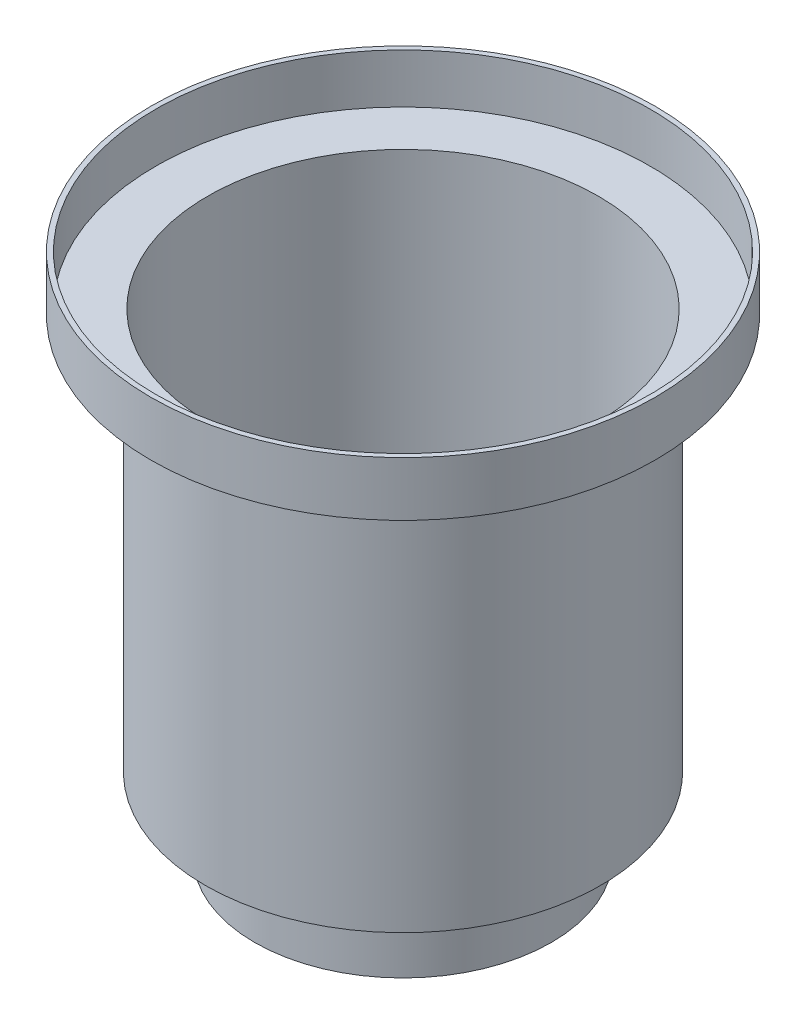
ISO-10303-21;
HEADER;
FILE_DESCRIPTION(('STEP AP214'),'2;1');
FILE_NAME('part.step','',(''),(''),'','','');
FILE_SCHEMA(('AUTOMOTIVE_DESIGN { 1 0 10303 214 1 1 1 1 }'));
ENDSEC;
DATA;
#1=APPLICATION_CONTEXT('core data for automotive mechanical design processes');
#2=APPLICATION_PROTOCOL_DEFINITION('international standard','automotive_design',2000,#1);
#3=PRODUCT_CONTEXT('',#1,'mechanical');
#4=PRODUCT('Part','Part','',(#3));
#5=PRODUCT_RELATED_PRODUCT_CATEGORY('part','',(#4));
#6=PRODUCT_DEFINITION_FORMATION('','',#4);
#7=PRODUCT_DEFINITION_CONTEXT('part definition',#1,'design');
#8=PRODUCT_DEFINITION('design','',#6,#7);
#9=PRODUCT_DEFINITION_SHAPE('','',#8);
#10=(LENGTH_UNIT() NAMED_UNIT(*) SI_UNIT(.MILLI.,.METRE.));
#11=(NAMED_UNIT(*) PLANE_ANGLE_UNIT() SI_UNIT($,.RADIAN.));
#12=(NAMED_UNIT(*) SI_UNIT($,.STERADIAN.) SOLID_ANGLE_UNIT());
#13=UNCERTAINTY_MEASURE_WITH_UNIT(LENGTH_MEASURE(1.E-05),#10,'distance_accuracy_value','');
#14=(GEOMETRIC_REPRESENTATION_CONTEXT(3) GLOBAL_UNCERTAINTY_ASSIGNED_CONTEXT((#13)) GLOBAL_UNIT_ASSIGNED_CONTEXT((#10,
#11,#12)) REPRESENTATION_CONTEXT('',''));
#15=CARTESIAN_POINT('',(0.,0.,0.));
#16=DIRECTION('',(0.,0.,1.));
#17=DIRECTION('',(1.,0.,0.));
#18=AXIS2_PLACEMENT_3D('',#15,#16,#17);
#19=CARTESIAN_POINT('',(0.,-8.6,0.));
#20=DIRECTION('',(0.,-1.,0.));
#21=DIRECTION('',(0.,0.,-1.));
#22=AXIS2_PLACEMENT_3D('',#19,#20,#21);
#23=PLANE('',#22);
#24=CARTESIAN_POINT('',(0.,-8.6,0.));
#25=DIRECTION('',(0.,-1.,0.));
#26=DIRECTION('',(0.,0.,-1.));
#27=AXIS2_PLACEMENT_3D('',#24,#25,#26);
#28=CIRCLE('',#27,2.77639320225002);
#29=CARTESIAN_POINT('',(0.,-8.6,-2.77639320225002));
#30=VERTEX_POINT('',#29);
#31=EDGE_CURVE('E141',#30,#30,#28,.T.);
#32=ORIENTED_EDGE('',*,*,#31,.F.);
#33=EDGE_LOOP('',(#32));
#34=FACE_BOUND('',#33,.T.);
#35=CARTESIAN_POINT('',(0.,-8.6,0.));
#36=DIRECTION('',(0.,-1.,0.));
#37=DIRECTION('',(0.,0.,-1.));
#38=AXIS2_PLACEMENT_3D('',#35,#36,#37);
#39=CIRCLE('',#38,2.9);
#40=CARTESIAN_POINT('',(0.,-8.6,-2.9));
#41=VERTEX_POINT('',#40);
#42=EDGE_CURVE('E12',#41,#41,#39,.F.);
#43=ORIENTED_EDGE('',*,*,#42,.F.);
#44=EDGE_LOOP('',(#43));
#45=FACE_BOUND('',#44,.T.);
#46=ADVANCED_FACE('F44',(#34,#45),#23,.T.);
#47=CARTESIAN_POINT('',(0.,1.,0.));
#48=DIRECTION('',(0.,1.,0.));
#49=DIRECTION('',(0.,0.,1.));
#50=AXIS2_PLACEMENT_3D('',#47,#48,#49);
#51=PLANE('',#50);
#52=CARTESIAN_POINT('',(0.,1.,0.));
#53=DIRECTION('',(0.,1.,0.));
#54=DIRECTION('',(0.,0.,1.));
#55=AXIS2_PLACEMENT_3D('',#52,#53,#54);
#56=CIRCLE('',#55,5.);
#57=CARTESIAN_POINT('',(0.,1.,5.));
#58=VERTEX_POINT('',#57);
#59=EDGE_CURVE('E103',#58,#58,#56,.T.);
#60=ORIENTED_EDGE('',*,*,#59,.F.);
#61=EDGE_LOOP('',(#60));
#62=FACE_BOUND('',#61,.T.);
#63=CARTESIAN_POINT('',(0.,1.,0.));
#64=DIRECTION('',(0.,1.,0.));
#65=DIRECTION('',(0.,0.,1.));
#66=AXIS2_PLACEMENT_3D('',#63,#64,#65);
#67=CIRCLE('',#66,5.1);
#68=CARTESIAN_POINT('',(0.,1.,5.1));
#69=VERTEX_POINT('',#68);
#70=EDGE_CURVE('E53',#69,#69,#67,.T.);
#71=ORIENTED_EDGE('',*,*,#70,.T.);
#72=EDGE_LOOP('',(#71));
#73=FACE_BOUND('',#72,.T.);
#74=ADVANCED_FACE('F72',(#62,#73),#51,.T.);
#75=CARTESIAN_POINT('',(0.,0.,0.));
#76=DIRECTION('',(0.,1.,0.));
#77=DIRECTION('',(0.,0.,1.));
#78=AXIS2_PLACEMENT_3D('',#75,#76,#77);
#79=CYLINDRICAL_SURFACE('',#78,5.1);
#80=ORIENTED_EDGE('',*,*,#70,.F.);
#81=EDGE_LOOP('',(#80));
#82=FACE_BOUND('',#81,.T.);
#83=CARTESIAN_POINT('',(0.,-0.1,0.));
#84=DIRECTION('',(0.,-1.,0.));
#85=DIRECTION('',(0.,0.,-1.));
#86=AXIS2_PLACEMENT_3D('',#83,#84,#85);
#87=CIRCLE('',#86,5.1);
#88=CARTESIAN_POINT('',(0.,-0.1,-5.1));
#89=VERTEX_POINT('',#88);
#90=EDGE_CURVE('E97',#89,#89,#87,.T.);
#91=ORIENTED_EDGE('',*,*,#90,.F.);
#92=EDGE_LOOP('',(#91));
#93=FACE_BOUND('',#92,.T.);
#94=ADVANCED_FACE('F46',(#82,#93),#79,.T.);
#95=CARTESIAN_POINT('',(0.,0.,0.));
#96=DIRECTION('',(0.,1.,0.));
#97=DIRECTION('',(0.,0.,1.));
#98=AXIS2_PLACEMENT_3D('',#95,#96,#97);
#99=CYLINDRICAL_SURFACE('',#98,5.);
#100=ORIENTED_EDGE('',*,*,#59,.T.);
#101=EDGE_LOOP('',(#100));
#102=FACE_BOUND('',#101,.T.);
#103=CARTESIAN_POINT('',(0.,0.,0.));
#104=DIRECTION('',(0.,1.,0.));
#105=DIRECTION('',(0.,0.,1.));
#106=AXIS2_PLACEMENT_3D('',#103,#104,#105);
#107=CIRCLE('',#106,5.);
#108=CARTESIAN_POINT('',(0.,0.,5.));
#109=VERTEX_POINT('',#108);
#110=EDGE_CURVE('E99',#109,#109,#107,.T.);
#111=ORIENTED_EDGE('',*,*,#110,.F.);
#112=EDGE_LOOP('',(#111));
#113=FACE_BOUND('',#112,.T.);
#114=ADVANCED_FACE('F79',(#102,#113),#99,.F.);
#115=CARTESIAN_POINT('',(0.,0.,0.));
#116=DIRECTION('',(0.,-1.,0.));
#117=DIRECTION('',(0.,0.,-1.));
#118=AXIS2_PLACEMENT_3D('',#115,#116,#117);
#119=PLANE('',#118);
#120=CARTESIAN_POINT('',(0.,0.,0.));
#121=DIRECTION('',(0.,1.,0.));
#122=DIRECTION('',(0.,0.,1.));
#123=AXIS2_PLACEMENT_3D('',#120,#121,#122);
#124=CIRCLE('',#123,3.95);
#125=CARTESIAN_POINT('',(0.,0.,3.95));
#126=VERTEX_POINT('',#125);
#127=EDGE_CURVE('E185',#126,#126,#124,.T.);
#128=ORIENTED_EDGE('',*,*,#127,.F.);
#129=EDGE_LOOP('',(#128));
#130=FACE_BOUND('',#129,.T.);
#131=ORIENTED_EDGE('',*,*,#110,.T.);
#132=EDGE_LOOP('',(#131));
#133=FACE_BOUND('',#132,.T.);
#134=ADVANCED_FACE('F89',(#130,#133),#119,.F.);
#135=CARTESIAN_POINT('',(0.,-0.1,0.));
#136=DIRECTION('',(0.,-1.,0.));
#137=DIRECTION('',(0.,0.,-1.));
#138=AXIS2_PLACEMENT_3D('',#135,#136,#137);
#139=PLANE('',#138);
#140=CARTESIAN_POINT('',(0.,-0.1,0.));
#141=DIRECTION('',(0.,-1.,0.));
#142=DIRECTION('',(0.,0.,-1.));
#143=AXIS2_PLACEMENT_3D('',#140,#141,#142);
#144=CIRCLE('',#143,4.);
#145=CARTESIAN_POINT('',(0.,-0.1,-4.));
#146=VERTEX_POINT('',#145);
#147=EDGE_CURVE('E106',#146,#146,#144,.T.);
#148=ORIENTED_EDGE('',*,*,#147,.F.);
#149=EDGE_LOOP('',(#148));
#150=FACE_BOUND('',#149,.T.);
#151=ORIENTED_EDGE('',*,*,#90,.T.);
#152=EDGE_LOOP('',(#151));
#153=FACE_BOUND('',#152,.T.);
#154=ADVANCED_FACE('F173',(#150,#153),#139,.T.);
#155=CARTESIAN_POINT('',(0.,-8.1,0.));
#156=DIRECTION('',(0.,1.,0.));
#157=DIRECTION('',(0.,0.,1.));
#158=AXIS2_PLACEMENT_3D('',#155,#156,#157);
#159=CYLINDRICAL_SURFACE('',#158,4.);
#160=CARTESIAN_POINT('',(0.,-8.1,0.));
#161=DIRECTION('',(0.,-1.,0.));
#162=DIRECTION('',(0.,0.,-1.));
#163=AXIS2_PLACEMENT_3D('',#160,#161,#162);
#164=CIRCLE('',#163,4.);
#165=CARTESIAN_POINT('',(0.,-8.1,-4.));
#166=VERTEX_POINT('',#165);
#167=EDGE_CURVE('E100',#166,#166,#164,.T.);
#168=ORIENTED_EDGE('',*,*,#167,.F.);
#169=EDGE_LOOP('',(#168));
#170=FACE_BOUND('',#169,.T.);
#171=ORIENTED_EDGE('',*,*,#147,.T.);
#172=EDGE_LOOP('',(#171));
#173=FACE_BOUND('',#172,.T.);
#174=ADVANCED_FACE('F169',(#170,#173),#159,.T.);
#175=CARTESIAN_POINT('',(0.,-8.1,0.));
#176=DIRECTION('',(0.,1.,0.));
#177=DIRECTION('',(0.,0.,1.));
#178=AXIS2_PLACEMENT_3D('',#175,#176,#177);
#179=CYLINDRICAL_SURFACE('',#178,3.95);
#180=CARTESIAN_POINT('',(0.,-8.1,0.));
#181=DIRECTION('',(0.,1.,0.));
#182=DIRECTION('',(0.,0.,1.));
#183=AXIS2_PLACEMENT_3D('',#180,#181,#182);
#184=CIRCLE('',#183,3.95);
#185=CARTESIAN_POINT('',(0.,-8.1,3.95));
#186=VERTEX_POINT('',#185);
#187=EDGE_CURVE('E189',#186,#186,#184,.T.);
#188=ORIENTED_EDGE('',*,*,#187,.F.);
#189=EDGE_LOOP('',(#188));
#190=FACE_BOUND('',#189,.T.);
#191=ORIENTED_EDGE('',*,*,#127,.T.);
#192=EDGE_LOOP('',(#191));
#193=FACE_BOUND('',#192,.T.);
#194=ADVANCED_FACE('F166',(#190,#193),#179,.F.);
#195=CARTESIAN_POINT('',(4.,-8.1,0.));
#196=DIRECTION('',(0.,1.,0.));
#197=DIRECTION('',(0.,0.,1.));
#198=AXIS2_PLACEMENT_3D('',#195,#196,#197);
#199=PLANE('',#198);
#200=CARTESIAN_POINT('',(0.,-8.1,0.));
#201=DIRECTION('',(0.,1.,0.));
#202=DIRECTION('',(0.,0.,1.));
#203=AXIS2_PLACEMENT_3D('',#200,#201,#202);
#204=CIRCLE('',#203,3.77639320225002);
#205=CARTESIAN_POINT('',(0.,-8.1,3.77639320225002));
#206=VERTEX_POINT('',#205);
#207=EDGE_CURVE('E144',#206,#206,#204,.F.);
#208=ORIENTED_EDGE('',*,*,#207,.T.);
#209=EDGE_LOOP('',(#208));
#210=FACE_BOUND('',#209,.T.);
#211=ORIENTED_EDGE('',*,*,#187,.T.);
#212=EDGE_LOOP('',(#211));
#213=FACE_BOUND('',#212,.T.);
#214=ADVANCED_FACE('F137',(#210,#213),#199,.T.);
#215=CARTESIAN_POINT('',(0.,-8.6,0.));
#216=DIRECTION('',(0.,1.,0.));
#217=DIRECTION('',(0.,0.,1.));
#218=AXIS2_PLACEMENT_3D('',#215,#216,#217);
#219=CONICAL_SURFACE('',#218,3.,1.10714871779409);
#220=CARTESIAN_POINT('',(0.,-8.6,0.));
#221=DIRECTION('',(0.,-1.,0.));
#222=DIRECTION('',(0.,0.,-1.));
#223=AXIS2_PLACEMENT_3D('',#220,#221,#222);
#224=CIRCLE('',#223,3.);
#225=CARTESIAN_POINT('',(0.,-8.6,-3.));
#226=VERTEX_POINT('',#225);
#227=EDGE_CURVE('E48',#226,#226,#224,.T.);
#228=ORIENTED_EDGE('',*,*,#227,.F.);
#229=EDGE_LOOP('',(#228));
#230=FACE_BOUND('',#229,.T.);
#231=ORIENTED_EDGE('',*,*,#167,.T.);
#232=EDGE_LOOP('',(#231));
#233=FACE_BOUND('',#232,.T.);
#234=ADVANCED_FACE('F132',(#230,#233),#219,.T.);
#235=CARTESIAN_POINT('',(0.,-8.51055728090001,0.));
#236=DIRECTION('',(0.,1.,0.));
#237=DIRECTION('',(0.,0.,1.));
#238=AXIS2_PLACEMENT_3D('',#235,#236,#237);
#239=CONICAL_SURFACE('',#238,2.95527864045,1.10714871779409);
#240=ORIENTED_EDGE('',*,*,#31,.T.);
#241=EDGE_LOOP('',(#240));
#242=FACE_BOUND('',#241,.T.);
#243=ORIENTED_EDGE('',*,*,#207,.F.);
#244=EDGE_LOOP('',(#243));
#245=FACE_BOUND('',#244,.T.);
#246=ADVANCED_FACE('F129',(#242,#245),#239,.F.);
#247=CARTESIAN_POINT('',(0.,-9.6,0.));
#248=DIRECTION('',(0.,1.,0.));
#249=DIRECTION('',(0.,0.,1.));
#250=AXIS2_PLACEMENT_3D('',#247,#248,#249);
#251=CYLINDRICAL_SURFACE('',#250,3.);
#252=CARTESIAN_POINT('',(0.,-9.6,0.));
#253=DIRECTION('',(0.,-1.,0.));
#254=DIRECTION('',(0.,0.,-1.));
#255=AXIS2_PLACEMENT_3D('',#252,#253,#254);
#256=CIRCLE('',#255,3.);
#257=CARTESIAN_POINT('',(0.,-9.6,-3.));
#258=VERTEX_POINT('',#257);
#259=EDGE_CURVE('E146',#258,#258,#256,.T.);
#260=ORIENTED_EDGE('',*,*,#259,.F.);
#261=EDGE_LOOP('',(#260));
#262=FACE_BOUND('',#261,.T.);
#263=ORIENTED_EDGE('',*,*,#227,.T.);
#264=EDGE_LOOP('',(#263));
#265=FACE_BOUND('',#264,.T.);
#266=ADVANCED_FACE('F120',(#262,#265),#251,.T.);
#267=CARTESIAN_POINT('',(0.,-9.6,0.));
#268=DIRECTION('',(0.,1.,0.));
#269=DIRECTION('',(0.,0.,1.));
#270=AXIS2_PLACEMENT_3D('',#267,#268,#269);
#271=CYLINDRICAL_SURFACE('',#270,2.9);
#272=CARTESIAN_POINT('',(0.,-9.6,0.));
#273=DIRECTION('',(0.,1.,0.));
#274=DIRECTION('',(0.,0.,1.));
#275=AXIS2_PLACEMENT_3D('',#272,#273,#274);
#276=CIRCLE('',#275,2.9);
#277=CARTESIAN_POINT('',(0.,-9.6,2.9));
#278=VERTEX_POINT('',#277);
#279=EDGE_CURVE('E149',#278,#278,#276,.T.);
#280=ORIENTED_EDGE('',*,*,#279,.F.);
#281=EDGE_LOOP('',(#280));
#282=FACE_BOUND('',#281,.T.);
#283=ORIENTED_EDGE('',*,*,#42,.T.);
#284=EDGE_LOOP('',(#283));
#285=FACE_BOUND('',#284,.T.);
#286=ADVANCED_FACE('F66',(#282,#285),#271,.F.);
#287=CARTESIAN_POINT('',(3.,-9.6,0.));
#288=DIRECTION('',(0.,1.,0.));
#289=DIRECTION('',(0.,0.,1.));
#290=AXIS2_PLACEMENT_3D('',#287,#288,#289);
#291=PLANE('',#290);
#292=ORIENTED_EDGE('',*,*,#279,.T.);
#293=EDGE_LOOP('',(#292));
#294=FACE_BOUND('',#293,.T.);
#295=ADVANCED_FACE('F59',(#294),#291,.T.);
#296=CARTESIAN_POINT('',(0.,-10.1,0.));
#297=DIRECTION('',(0.,1.,0.));
#298=DIRECTION('',(0.,0.,1.));
#299=AXIS2_PLACEMENT_3D('',#296,#297,#298);
#300=CONICAL_SURFACE('',#299,0.,1.40564764938027);
#301=ORIENTED_EDGE('',*,*,#259,.T.);
#302=EDGE_LOOP('',(#301));
#303=FACE_BOUND('',#302,.T.);
#304=CARTESIAN_POINT('',(0.,-10.1,0.));
#305=VERTEX_POINT('',#304);
#306=VERTEX_LOOP('',#305);
#307=FACE_BOUND('',#306,.T.);
#308=ADVANCED_FACE('F57',(#303,#307),#300,.T.);
#309=CLOSED_SHELL('',(#46,#74,#94,#114,#134,#154,#174,#194,#214,#234,#246,#266,#286,#295,#308));
#310=CARTESIAN_POINT('',(3.,-9.7,0.));
#311=DIRECTION('',(0.,1.,0.));
#312=DIRECTION('',(0.,0.,1.));
#313=AXIS2_PLACEMENT_3D('',#310,#311,#312);
#314=PLANE('',#313);
#315=CARTESIAN_POINT('',(0.,-9.7,0.));
#316=DIRECTION('',(0.,-1.,0.));
#317=DIRECTION('',(0.,0.,-1.));
#318=AXIS2_PLACEMENT_3D('',#315,#316,#317);
#319=CIRCLE('',#318,0.0999999999999993);
#320=CARTESIAN_POINT('',(0.,-9.7,-0.0999999999999993));
#321=VERTEX_POINT('',#320);
#322=EDGE_CURVE('E286',#321,#321,#319,.T.);
#323=ORIENTED_EDGE('',*,*,#322,.F.);
#324=EDGE_LOOP('',(#323));
#325=FACE_BOUND('',#324,.T.);
#326=CARTESIAN_POINT('',(0.,-9.7,0.));
#327=DIRECTION('',(0.,-1.,0.));
#328=DIRECTION('',(0.,0.,-1.));
#329=AXIS2_PLACEMENT_3D('',#326,#327,#328);
#330=CIRCLE('',#329,1.79172374697019);
#331=CARTESIAN_POINT('',(0.,-9.7,1.79172374697019));
#332=VERTEX_POINT('',#331);
#333=EDGE_CURVE('E282',#332,#332,#330,.T.);
#334=ORIENTED_EDGE('',*,*,#333,.T.);
#335=EDGE_LOOP('',(#334));
#336=FACE_BOUND('',#335,.T.);
#337=ADVANCED_FACE('F251',(#325,#336),#314,.F.);
#338=CARTESIAN_POINT('',(0.,-16.3691748542061,0.));
#339=DIRECTION('',(0.,-1.,0.));
#340=DIRECTION('',(0.,0.,-1.));
#341=AXIS2_PLACEMENT_3D('',#338,#339,#340);
#342=CYLINDRICAL_SURFACE('',#341,0.0999999999999996);
#343=CARTESIAN_POINT('',(0.,-9.98195395782836,0.));
#344=DIRECTION('',(0.,-1.,0.));
#345=DIRECTION('',(0.,0.,-1.));
#346=AXIS2_PLACEMENT_3D('',#343,#344,#345);
#347=CIRCLE('',#346,0.0999999999999998);
#348=CARTESIAN_POINT('',(0.,-9.98195395782836,0.100000000000005));
#349=VERTEX_POINT('',#348);
#350=EDGE_CURVE('E285',#349,#349,#347,.T.);
#351=ORIENTED_EDGE('',*,*,#350,.F.);
#352=EDGE_LOOP('',(#351));
#353=FACE_BOUND('',#352,.T.);
#354=ORIENTED_EDGE('',*,*,#322,.T.);
#355=EDGE_LOOP('',(#354));
#356=FACE_BOUND('',#355,.T.);
#357=ADVANCED_FACE('F254',(#353,#356),#342,.T.);
#358=CARTESIAN_POINT('',(0.,-9.98195395782836,0.));
#359=DIRECTION('',(0.,1.,0.));
#360=DIRECTION('',(0.,0.,1.));
#361=AXIS2_PLACEMENT_3D('',#358,#359,#360);
#362=CONICAL_SURFACE('',#361,0.0999999999999998,1.40564764938027);
#363=CARTESIAN_POINT('',(0.,-9.7,1.79172374697019));
#364=CARTESIAN_POINT('',(0.,-9.70293702039404,1.77410162460592));
#365=CARTESIAN_POINT('',(0.,-9.70587404078809,1.75647950224165));
#366=CARTESIAN_POINT('',(0.,-9.71174808157618,1.7212352575131));
#367=CARTESIAN_POINT('',(0.,-9.71468510197023,1.70361313514883));
#368=CARTESIAN_POINT('',(0.,-9.72055914275832,1.66836889042028));
#369=CARTESIAN_POINT('',(0.,-9.72349616315236,1.65074676805601));
#370=CARTESIAN_POINT('',(0.,-9.72937020394045,1.61550252332746));
#371=CARTESIAN_POINT('',(0.,-9.7323072243345,1.59788040096319));
#372=CARTESIAN_POINT('',(0.,-9.73818126512259,1.56263615623464));
#373=CARTESIAN_POINT('',(0.,-9.74111828551664,1.54501403387037));
#374=CARTESIAN_POINT('',(0.,-9.74699232630473,1.50976978914183));
#375=CARTESIAN_POINT('',(0.,-9.74992934669877,1.49214766677755));
#376=CARTESIAN_POINT('',(0.,-9.75580338748686,1.45690342204901));
#377=CARTESIAN_POINT('',(0.,-9.75874040788091,1.43928129968474));
#378=CARTESIAN_POINT('',(0.,-9.764614448669,1.40403705495619));
#379=CARTESIAN_POINT('',(0.,-9.76755146906305,1.38641493259192));
#380=CARTESIAN_POINT('',(0.,-9.77342550985114,1.35117068786337));
#381=CARTESIAN_POINT('',(0.,-9.77636253024518,1.3335485654991));
#382=CARTESIAN_POINT('',(0.,-9.78223657103327,1.29830432077055));
#383=CARTESIAN_POINT('',(0.,-9.78517359142732,1.28068219840628));
#384=CARTESIAN_POINT('',(0.,-9.79104763221541,1.24543795367773));
#385=CARTESIAN_POINT('',(0.,-9.79398465260945,1.22781583131346));
#386=CARTESIAN_POINT('',(0.,-9.79985869339755,1.19257158658492));
#387=CARTESIAN_POINT('',(0.,-9.80279571379159,1.17494946422064));
#388=CARTESIAN_POINT('',(0.,-9.80866975457968,1.1397052194921));
#389=CARTESIAN_POINT('',(0.,-9.81160677497373,1.12208309712783));
#390=CARTESIAN_POINT('',(0.,-9.81748081576182,1.08683885239928));
#391=CARTESIAN_POINT('',(0.,-9.82041783615586,1.06921673003501));
#392=CARTESIAN_POINT('',(0.,-9.82629187694395,1.03397248530646));
#393=CARTESIAN_POINT('',(0.,-9.829228897338,1.01635036294219));
#394=CARTESIAN_POINT('',(0.,-9.83510293812609,0.981106118213643));
#395=CARTESIAN_POINT('',(0.,-9.83803995852014,0.963483995849371));
#396=CARTESIAN_POINT('',(0.,-9.84391399930823,0.928239751120825));
#397=CARTESIAN_POINT('',(0.,-9.84685101970227,0.910617628756552));
#398=CARTESIAN_POINT('',(0.,-9.85272506049036,0.875373384028007));
#399=CARTESIAN_POINT('',(0.,-9.85566208088441,0.857751261663734));
#400=CARTESIAN_POINT('',(0.,-9.8615361216725,0.822507016935189));
#401=CARTESIAN_POINT('',(0.,-9.86447314206655,0.804884894570916));
#402=CARTESIAN_POINT('',(0.,-9.87034718285464,0.76964064984237));
#403=CARTESIAN_POINT('',(0.,-9.87328420324868,0.752018527478097));
#404=CARTESIAN_POINT('',(0.,-9.87915824403677,0.716774282749552));
#405=CARTESIAN_POINT('',(0.,-9.88209526443082,0.699152160385279));
#406=CARTESIAN_POINT('',(0.,-9.88796930521891,0.663907915656734));
#407=CARTESIAN_POINT('',(0.,-9.89090632561295,0.646285793292461));
#408=CARTESIAN_POINT('',(0.,-9.89678036640105,0.611041548563915));
#409=CARTESIAN_POINT('',(0.,-9.89971738679509,0.593419426199642));
#410=CARTESIAN_POINT('',(0.,-9.90559142758318,0.558175181471097));
#411=CARTESIAN_POINT('',(0.,-9.90852844797723,0.540553059106824));
#412=CARTESIAN_POINT('',(0.,-9.91440248876532,0.505308814378279));
#413=CARTESIAN_POINT('',(0.,-9.91733950915937,0.487686692014006));
#414=CARTESIAN_POINT('',(0.,-9.92321354994746,0.45244244728546));
#415=CARTESIAN_POINT('',(0.,-9.9261505703415,0.434820324921188));
#416=CARTESIAN_POINT('',(0.,-9.93202461112959,0.399576080192642));
#417=CARTESIAN_POINT('',(0.,-9.93496163152364,0.381953957828369));
#418=CARTESIAN_POINT('',(0.,-9.94083567231173,0.346709713099824));
#419=CARTESIAN_POINT('',(0.,-9.94377269270577,0.329087590735551));
#420=CARTESIAN_POINT('',(0.,-9.94964673349386,0.293843346007005));
#421=CARTESIAN_POINT('',(0.,-9.95258375388791,0.276221223642733));
#422=CARTESIAN_POINT('',(0.,-9.958457794676,0.240976978914187));
#423=CARTESIAN_POINT('',(0.,-9.96139481507005,0.223354856549914));
#424=CARTESIAN_POINT('',(0.,-9.96726885585814,0.188110611821369));
#425=CARTESIAN_POINT('',(0.,-9.97020587625218,0.170488489457096));
#426=CARTESIAN_POINT('',(0.,-9.97607991704027,0.135244244728551));
#427=CARTESIAN_POINT('',(0.,-9.97901693743432,0.117622122364278));
#428=CARTESIAN_POINT('',(0.,-9.98195395782836,0.100000000000005));
#429=B_SPLINE_CURVE_WITH_KNOTS('',3,(#363,#364,#365,#366,#367,#368,#369,#370,#371,#372,#373,
#374,#375,#376,#377,#378,#379,#380,#381,#382,#383,#384,#385,#386,#387,#388,#389,#390,#391,#392,
#393,#394,#395,#396,#397,#398,#399,#400,#401,#402,#403,#404,#405,#406,#407,#408,#409,#410,#411,
#412,#413,#414,#415,#416,#417,#418,#419,#420,#421,#422,#423,#424,#425,#426,#427,#428),
.UNSPECIFIED.,.F.,.F.,(4,2,2,2,2,2,2,2,2,2,2,2,2,2,2,2,2,2,2,2,2,2,2,2,2,2,2,2,2,2,2,2,4),(0.,
0.0535955928108641,0.107191185621729,0.160786778432593,0.214382371243457,0.267977964054322,
0.321573556865186,0.37516914967605,0.428764742486915,0.482360335297779,0.535955928108643,
0.589551520919508,0.643147113730372,0.696742706541236,0.750338299352101,0.803933892162965,
0.857529484973829,0.911125077784694,0.964720670595558,1.01831626340642,1.07191185621729,
1.12550744902815,1.17910304183902,1.23269863464988,1.28629422746074,1.33988982027161,
1.39348541308247,1.44708100589334,1.5006765987042,1.55427219151507,1.60786778432593,
1.6614633771368,1.71505896994766),.UNSPECIFIED.);
#430=EDGE_CURVE('BSEAM264',#332,#349,#429,.T.);
#431=ORIENTED_EDGE('',*,*,#333,.F.);
#432=ORIENTED_EDGE('',*,*,#350,.T.);
#433=ORIENTED_EDGE('',*,*,#430,.T.);
#434=ORIENTED_EDGE('',*,*,#430,.F.);
#435=EDGE_LOOP('',(#431,#433,#432,#434));
#436=FACE_BOUND('',#435,.T.);
#437=ADVANCED_FACE('F264',(#436),#362,.F.);
#438=CLOSED_SHELL('',(#337,#357,#437));
#439=ORIENTED_CLOSED_SHELL('',*,#438,.T.);
#440=BREP_WITH_VOIDS('B2',#309,(#439));
#441=ADVANCED_BREP_SHAPE_REPRESENTATION('',(#18,#440),#14);
#442=SHAPE_DEFINITION_REPRESENTATION(#9,#441);
ENDSEC;
END-ISO-10303-21;
